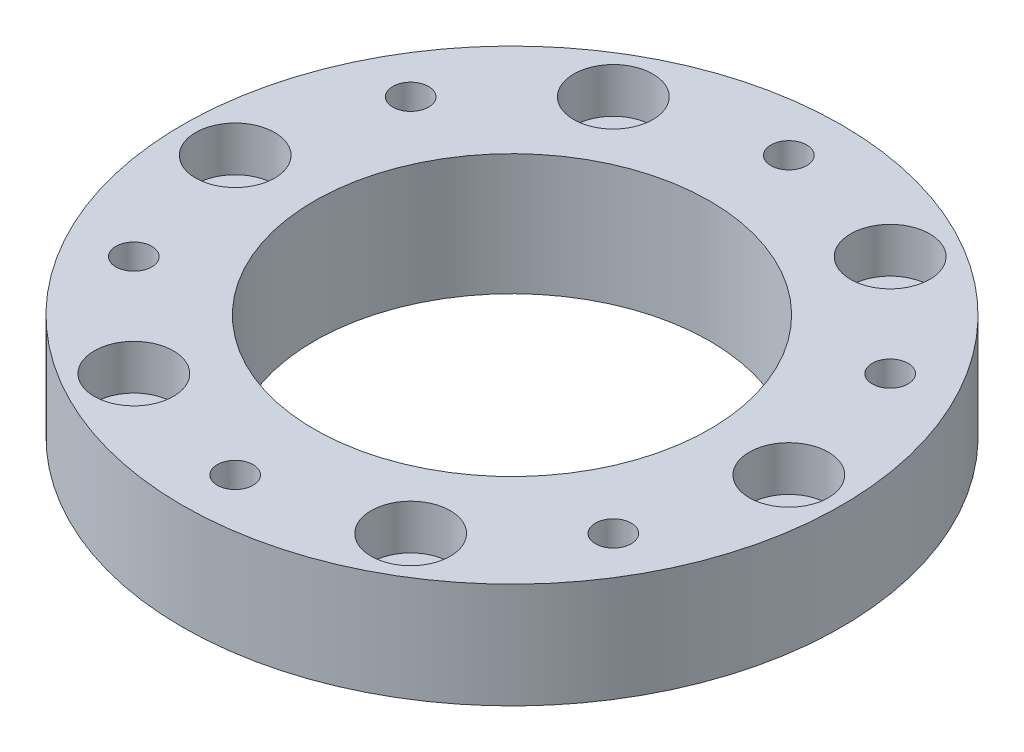
ISO-10303-21;
HEADER;
FILE_DESCRIPTION(('STEP AP214'),'2;1');
FILE_NAME('part.step','',(''),(''),'','','');
FILE_SCHEMA(('AUTOMOTIVE_DESIGN { 1 0 10303 214 1 1 1 1 }'));
ENDSEC;
DATA;
#1=APPLICATION_CONTEXT('core data for automotive mechanical design processes');
#2=APPLICATION_PROTOCOL_DEFINITION('international standard','automotive_design',2000,#1);
#3=PRODUCT_CONTEXT('',#1,'mechanical');
#4=PRODUCT('Part','Part','',(#3));
#5=PRODUCT_RELATED_PRODUCT_CATEGORY('part','',(#4));
#6=PRODUCT_DEFINITION_FORMATION('','',#4);
#7=PRODUCT_DEFINITION_CONTEXT('part definition',#1,'design');
#8=PRODUCT_DEFINITION('design','',#6,#7);
#9=PRODUCT_DEFINITION_SHAPE('','',#8);
#10=(LENGTH_UNIT() NAMED_UNIT(*) SI_UNIT(.MILLI.,.METRE.));
#11=(NAMED_UNIT(*) PLANE_ANGLE_UNIT() SI_UNIT($,.RADIAN.));
#12=(NAMED_UNIT(*) SI_UNIT($,.STERADIAN.) SOLID_ANGLE_UNIT());
#13=UNCERTAINTY_MEASURE_WITH_UNIT(LENGTH_MEASURE(1.E-05),#10,'distance_accuracy_value','');
#14=(GEOMETRIC_REPRESENTATION_CONTEXT(3) GLOBAL_UNCERTAINTY_ASSIGNED_CONTEXT((#13)) GLOBAL_UNIT_ASSIGNED_CONTEXT((#10,
#11,#12)) REPRESENTATION_CONTEXT('',''));
#15=CARTESIAN_POINT('',(0.,0.,0.));
#16=DIRECTION('',(0.,0.,1.));
#17=DIRECTION('',(1.,0.,0.));
#18=AXIS2_PLACEMENT_3D('',#15,#16,#17);
#19=CARTESIAN_POINT('',(26.2500000000006,23.,-45.4663336986827));
#20=DIRECTION('',(0.,1.,0.));
#21=DIRECTION('',(0.,0.,1.));
#22=AXIS2_PLACEMENT_3D('',#19,#20,#21);
#23=CYLINDRICAL_SURFACE('',#22,4.5);
#24=CARTESIAN_POINT('',(26.2500000000006,3.,-45.4663336986827));
#25=DIRECTION('',(0.,1.,0.));
#26=DIRECTION('',(0.,0.,1.));
#27=AXIS2_PLACEMENT_3D('',#24,#25,#26);
#28=CIRCLE('',#27,4.5);
#29=CARTESIAN_POINT('',(26.2500000000006,3.,-40.9663336986827));
#30=VERTEX_POINT('',#29);
#31=EDGE_CURVE('E146',#30,#30,#28,.F.);
#32=ORIENTED_EDGE('',*,*,#31,.T.);
#33=EDGE_LOOP('',(#32));
#34=FACE_BOUND('',#33,.T.);
#35=CARTESIAN_POINT('',(26.2500000000006,14.5,-45.4663336986827));
#36=DIRECTION('',(0.,1.,0.));
#37=DIRECTION('',(0.,0.,1.));
#38=AXIS2_PLACEMENT_3D('',#35,#36,#37);
#39=CIRCLE('',#38,4.5);
#40=CARTESIAN_POINT('',(26.2500000000006,14.5,-40.9663336986827));
#41=VERTEX_POINT('',#40);
#42=EDGE_CURVE('E20',#41,#41,#39,.T.);
#43=ORIENTED_EDGE('',*,*,#42,.T.);
#44=EDGE_LOOP('',(#43));
#45=FACE_BOUND('',#44,.T.);
#46=ADVANCED_FACE('F17',(#34,#45),#23,.F.);
#47=CARTESIAN_POINT('',(-26.2499999999996,23.,-45.4663336986833));
#48=DIRECTION('',(0.,1.,0.));
#49=DIRECTION('',(0.,0.,1.));
#50=AXIS2_PLACEMENT_3D('',#47,#48,#49);
#51=CYLINDRICAL_SURFACE('',#50,4.5);
#52=CARTESIAN_POINT('',(-26.2499999999996,3.,-45.4663336986833));
#53=DIRECTION('',(0.,1.,0.));
#54=DIRECTION('',(0.,0.,1.));
#55=AXIS2_PLACEMENT_3D('',#52,#53,#54);
#56=CIRCLE('',#55,4.5);
#57=CARTESIAN_POINT('',(-26.2499999999996,3.,-40.9663336986833));
#58=VERTEX_POINT('',#57);
#59=EDGE_CURVE('E143',#58,#58,#56,.F.);
#60=ORIENTED_EDGE('',*,*,#59,.T.);
#61=EDGE_LOOP('',(#60));
#62=FACE_BOUND('',#61,.T.);
#63=CARTESIAN_POINT('',(-26.2499999999996,14.5,-45.4663336986833));
#64=DIRECTION('',(0.,1.,0.));
#65=DIRECTION('',(0.,0.,1.));
#66=AXIS2_PLACEMENT_3D('',#63,#64,#65);
#67=CIRCLE('',#66,4.5);
#68=CARTESIAN_POINT('',(-26.2499999999996,14.5,-40.9663336986833));
#69=VERTEX_POINT('',#68);
#70=EDGE_CURVE('E160',#69,#69,#67,.T.);
#71=ORIENTED_EDGE('',*,*,#70,.T.);
#72=EDGE_LOOP('',(#71));
#73=FACE_BOUND('',#72,.T.);
#74=ADVANCED_FACE('F282',(#62,#73),#51,.F.);
#75=CARTESIAN_POINT('',(-52.5,23.,0.));
#76=DIRECTION('',(0.,1.,0.));
#77=DIRECTION('',(0.,0.,1.));
#78=AXIS2_PLACEMENT_3D('',#75,#76,#77);
#79=CYLINDRICAL_SURFACE('',#78,4.5);
#80=CARTESIAN_POINT('',(-52.5,3.,0.));
#81=DIRECTION('',(0.,1.,0.));
#82=DIRECTION('',(0.,0.,1.));
#83=AXIS2_PLACEMENT_3D('',#80,#81,#82);
#84=CIRCLE('',#83,4.5);
#85=CARTESIAN_POINT('',(-52.5,3.,4.5));
#86=VERTEX_POINT('',#85);
#87=EDGE_CURVE('E140',#86,#86,#84,.F.);
#88=ORIENTED_EDGE('',*,*,#87,.T.);
#89=EDGE_LOOP('',(#88));
#90=FACE_BOUND('',#89,.T.);
#91=CARTESIAN_POINT('',(-52.5,14.5,0.));
#92=DIRECTION('',(0.,1.,0.));
#93=DIRECTION('',(0.,0.,1.));
#94=AXIS2_PLACEMENT_3D('',#91,#92,#93);
#95=CIRCLE('',#94,4.5);
#96=CARTESIAN_POINT('',(-52.5,14.5,4.5));
#97=VERTEX_POINT('',#96);
#98=EDGE_CURVE('E158',#97,#97,#95,.T.);
#99=ORIENTED_EDGE('',*,*,#98,.T.);
#100=EDGE_LOOP('',(#99));
#101=FACE_BOUND('',#100,.T.);
#102=ADVANCED_FACE('F279',(#90,#101),#79,.F.);
#103=CARTESIAN_POINT('',(-26.25,23.,45.4663336986829));
#104=DIRECTION('',(0.,1.,0.));
#105=DIRECTION('',(0.,0.,1.));
#106=AXIS2_PLACEMENT_3D('',#103,#104,#105);
#107=CYLINDRICAL_SURFACE('',#106,4.5);
#108=CARTESIAN_POINT('',(-26.25,3.,45.4663336986829));
#109=DIRECTION('',(0.,1.,0.));
#110=DIRECTION('',(0.,0.,1.));
#111=AXIS2_PLACEMENT_3D('',#108,#109,#110);
#112=CIRCLE('',#111,4.5);
#113=CARTESIAN_POINT('',(-26.25,3.,49.9663336986829));
#114=VERTEX_POINT('',#113);
#115=EDGE_CURVE('E137',#114,#114,#112,.F.);
#116=ORIENTED_EDGE('',*,*,#115,.T.);
#117=EDGE_LOOP('',(#116));
#118=FACE_BOUND('',#117,.T.);
#119=CARTESIAN_POINT('',(-26.25,14.5,45.4663336986829));
#120=DIRECTION('',(0.,1.,0.));
#121=DIRECTION('',(0.,0.,1.));
#122=AXIS2_PLACEMENT_3D('',#119,#120,#121);
#123=CIRCLE('',#122,4.5);
#124=CARTESIAN_POINT('',(-26.25,14.5,49.9663336986829));
#125=VERTEX_POINT('',#124);
#126=EDGE_CURVE('E155',#125,#125,#123,.T.);
#127=ORIENTED_EDGE('',*,*,#126,.T.);
#128=EDGE_LOOP('',(#127));
#129=FACE_BOUND('',#128,.T.);
#130=ADVANCED_FACE('F281',(#118,#129),#107,.F.);
#131=CARTESIAN_POINT('',(26.25,23.,45.4663336986831));
#132=DIRECTION('',(0.,1.,0.));
#133=DIRECTION('',(0.,0.,1.));
#134=AXIS2_PLACEMENT_3D('',#131,#132,#133);
#135=CYLINDRICAL_SURFACE('',#134,4.5);
#136=CARTESIAN_POINT('',(26.25,3.,45.4663336986831));
#137=DIRECTION('',(0.,1.,0.));
#138=DIRECTION('',(0.,0.,1.));
#139=AXIS2_PLACEMENT_3D('',#136,#137,#138);
#140=CIRCLE('',#139,4.5);
#141=CARTESIAN_POINT('',(26.25,3.,49.9663336986831));
#142=VERTEX_POINT('',#141);
#143=EDGE_CURVE('E134',#142,#142,#140,.F.);
#144=ORIENTED_EDGE('',*,*,#143,.T.);
#145=EDGE_LOOP('',(#144));
#146=FACE_BOUND('',#145,.T.);
#147=CARTESIAN_POINT('',(26.25,14.5,45.4663336986831));
#148=DIRECTION('',(0.,1.,0.));
#149=DIRECTION('',(0.,0.,1.));
#150=AXIS2_PLACEMENT_3D('',#147,#148,#149);
#151=CIRCLE('',#150,4.5);
#152=CARTESIAN_POINT('',(26.25,14.5,49.9663336986831));
#153=VERTEX_POINT('',#152);
#154=EDGE_CURVE('E152',#153,#153,#151,.T.);
#155=ORIENTED_EDGE('',*,*,#154,.T.);
#156=EDGE_LOOP('',(#155));
#157=FACE_BOUND('',#156,.T.);
#158=ADVANCED_FACE('F290',(#146,#157),#135,.F.);
#159=CARTESIAN_POINT('',(52.5,23.,0.));
#160=DIRECTION('',(0.,1.,0.));
#161=DIRECTION('',(0.,0.,1.));
#162=AXIS2_PLACEMENT_3D('',#159,#160,#161);
#163=CYLINDRICAL_SURFACE('',#162,4.5);
#164=CARTESIAN_POINT('',(52.5,3.,0.));
#165=DIRECTION('',(0.,1.,0.));
#166=DIRECTION('',(0.,0.,1.));
#167=AXIS2_PLACEMENT_3D('',#164,#165,#166);
#168=CIRCLE('',#167,4.5);
#169=CARTESIAN_POINT('',(52.5,3.,4.5));
#170=VERTEX_POINT('',#169);
#171=EDGE_CURVE('E131',#170,#170,#168,.F.);
#172=ORIENTED_EDGE('',*,*,#171,.T.);
#173=EDGE_LOOP('',(#172));
#174=FACE_BOUND('',#173,.T.);
#175=CARTESIAN_POINT('',(52.5,14.5,0.));
#176=DIRECTION('',(0.,1.,0.));
#177=DIRECTION('',(0.,0.,1.));
#178=AXIS2_PLACEMENT_3D('',#175,#176,#177);
#179=CIRCLE('',#178,4.5);
#180=CARTESIAN_POINT('',(52.5,14.5,4.5));
#181=VERTEX_POINT('',#180);
#182=EDGE_CURVE('E149',#181,#181,#179,.T.);
#183=ORIENTED_EDGE('',*,*,#182,.T.);
#184=EDGE_LOOP('',(#183));
#185=FACE_BOUND('',#184,.T.);
#186=ADVANCED_FACE('F297',(#174,#185),#163,.F.);
#187=CARTESIAN_POINT('',(0.,3.,0.));
#188=DIRECTION('',(0.,-1.,0.));
#189=DIRECTION('',(0.,0.,-1.));
#190=AXIS2_PLACEMENT_3D('',#187,#188,#189);
#191=CYLINDRICAL_SURFACE('',#190,45.);
#192=CARTESIAN_POINT('',(0.,3.,0.));
#193=DIRECTION('',(0.,-1.,0.));
#194=DIRECTION('',(0.,0.,-1.));
#195=AXIS2_PLACEMENT_3D('',#192,#193,#194);
#196=CIRCLE('',#195,45.);
#197=CARTESIAN_POINT('',(0.,3.,-45.));
#198=VERTEX_POINT('',#197);
#199=EDGE_CURVE('E62',#198,#198,#196,.T.);
#200=ORIENTED_EDGE('',*,*,#199,.T.);
#201=EDGE_LOOP('',(#200));
#202=FACE_BOUND('',#201,.T.);
#203=CARTESIAN_POINT('',(0.,0.,0.));
#204=DIRECTION('',(0.,-1.,0.));
#205=DIRECTION('',(0.,0.,-1.));
#206=AXIS2_PLACEMENT_3D('',#203,#204,#205);
#207=CIRCLE('',#206,45.);
#208=CARTESIAN_POINT('',(0.,0.,-45.));
#209=VERTEX_POINT('',#208);
#210=EDGE_CURVE('E56',#209,#209,#207,.F.);
#211=ORIENTED_EDGE('',*,*,#210,.T.);
#212=EDGE_LOOP('',(#211));
#213=FACE_BOUND('',#212,.T.);
#214=ADVANCED_FACE('F49',(#202,#213),#191,.T.);
#215=CARTESIAN_POINT('',(-45.4663336986827,8.00000000009504,-26.2500000000006));
#216=DIRECTION('',(0.,1.,0.));
#217=DIRECTION('',(0.,0.,1.));
#218=AXIS2_PLACEMENT_3D('',#215,#216,#217);
#219=CONICAL_SURFACE('',#218,3.40000000016569,1.02974425867367);
#220=CARTESIAN_POINT('',(-45.4663336986827,5.95707389533118,-26.2500000000006));
#221=VERTEX_POINT('',#220);
#222=VERTEX_LOOP('',#221);
#223=FACE_BOUND('',#222,.T.);
#224=CARTESIAN_POINT('',(-45.4663336986827,8.,-26.2500000000006));
#225=DIRECTION('',(0.,1.,0.));
#226=DIRECTION('',(0.,0.,1.));
#227=AXIS2_PLACEMENT_3D('',#224,#225,#226);
#228=CIRCLE('',#227,3.4);
#229=CARTESIAN_POINT('',(-45.4663336986827,8.,-22.8500000000006));
#230=VERTEX_POINT('',#229);
#231=EDGE_CURVE('E53',#230,#230,#228,.T.);
#232=ORIENTED_EDGE('',*,*,#231,.T.);
#233=EDGE_LOOP('',(#232));
#234=FACE_BOUND('',#233,.T.);
#235=ADVANCED_FACE('F45',(#223,#234),#219,.F.);
#236=CARTESIAN_POINT('',(-45.4663336986833,8.00000000015189,26.2499999999996));
#237=DIRECTION('',(0.,1.,0.));
#238=DIRECTION('',(0.,0.,1.));
#239=AXIS2_PLACEMENT_3D('',#236,#237,#238);
#240=CONICAL_SURFACE('',#239,3.40000000023152,1.02974425867615);
#241=CARTESIAN_POINT('',(-45.4663336986833,5.95707389533118,26.2499999999996));
#242=VERTEX_POINT('',#241);
#243=VERTEX_LOOP('',#242);
#244=FACE_BOUND('',#243,.T.);
#245=CARTESIAN_POINT('',(-45.4663336986833,8.,26.2499999999996));
#246=DIRECTION('',(0.,1.,0.));
#247=DIRECTION('',(0.,0.,1.));
#248=AXIS2_PLACEMENT_3D('',#245,#246,#247);
#249=CIRCLE('',#248,3.4);
#250=CARTESIAN_POINT('',(-45.4663336986833,8.,29.6499999999996));
#251=VERTEX_POINT('',#250);
#252=EDGE_CURVE('E55',#251,#251,#249,.T.);
#253=ORIENTED_EDGE('',*,*,#252,.T.);
#254=EDGE_LOOP('',(#253));
#255=FACE_BOUND('',#254,.T.);
#256=ADVANCED_FACE('F48',(#244,#255),#240,.F.);
#257=CARTESIAN_POINT('',(0.,7.99999999986767,52.5));
#258=DIRECTION('',(0.,1.,0.));
#259=DIRECTION('',(0.,0.,1.));
#260=AXIS2_PLACEMENT_3D('',#257,#258,#259);
#261=CONICAL_SURFACE('',#260,3.3999999997809,1.02974425861699);
#262=CARTESIAN_POINT('',(0.,5.95707389527433,52.5));
#263=VERTEX_POINT('',#262);
#264=VERTEX_LOOP('',#263);
#265=FACE_BOUND('',#264,.T.);
#266=CARTESIAN_POINT('',(0.,8.,52.5));
#267=DIRECTION('',(0.,1.,0.));
#268=DIRECTION('',(0.,0.,1.));
#269=AXIS2_PLACEMENT_3D('',#266,#267,#268);
#270=CIRCLE('',#269,3.4);
#271=CARTESIAN_POINT('',(0.,8.,55.9));
#272=VERTEX_POINT('',#271);
#273=EDGE_CURVE('E59',#272,#272,#270,.T.);
#274=ORIENTED_EDGE('',*,*,#273,.T.);
#275=EDGE_LOOP('',(#274));
#276=FACE_BOUND('',#275,.T.);
#277=ADVANCED_FACE('F307',(#265,#276),#261,.F.);
#278=CARTESIAN_POINT('',(45.4663336986829,8.00000000015189,26.25));
#279=DIRECTION('',(0.,1.,0.));
#280=DIRECTION('',(0.,0.,1.));
#281=AXIS2_PLACEMENT_3D('',#278,#279,#280);
#282=CONICAL_SURFACE('',#281,3.40000000023089,1.02974425867615);
#283=CARTESIAN_POINT('',(45.4663336986829,5.95707389533118,26.25));
#284=VERTEX_POINT('',#283);
#285=VERTEX_LOOP('',#284);
#286=FACE_BOUND('',#285,.T.);
#287=CARTESIAN_POINT('',(45.4663336986829,8.,26.25));
#288=DIRECTION('',(0.,1.,0.));
#289=DIRECTION('',(0.,0.,1.));
#290=AXIS2_PLACEMENT_3D('',#287,#288,#289);
#291=CIRCLE('',#290,3.4);
#292=CARTESIAN_POINT('',(45.4663336986829,8.,29.65));
#293=VERTEX_POINT('',#292);
#294=EDGE_CURVE('E325',#293,#293,#291,.T.);
#295=ORIENTED_EDGE('',*,*,#294,.T.);
#296=EDGE_LOOP('',(#295));
#297=FACE_BOUND('',#296,.T.);
#298=ADVANCED_FACE('F310',(#286,#297),#282,.F.);
#299=CARTESIAN_POINT('',(45.4663336986831,8.00000000009504,-26.25));
#300=DIRECTION('',(0.,1.,0.));
#301=DIRECTION('',(0.,0.,1.));
#302=AXIS2_PLACEMENT_3D('',#299,#300,#301);
#303=CONICAL_SURFACE('',#302,3.40000000016506,1.02974425867367);
#304=CARTESIAN_POINT('',(45.4663336986831,5.95707389533118,-26.25));
#305=VERTEX_POINT('',#304);
#306=VERTEX_LOOP('',#305);
#307=FACE_BOUND('',#306,.T.);
#308=CARTESIAN_POINT('',(45.4663336986831,8.,-26.25));
#309=DIRECTION('',(0.,1.,0.));
#310=DIRECTION('',(0.,0.,1.));
#311=AXIS2_PLACEMENT_3D('',#308,#309,#310);
#312=CIRCLE('',#311,3.4);
#313=CARTESIAN_POINT('',(45.4663336986831,8.,-22.85));
#314=VERTEX_POINT('',#313);
#315=EDGE_CURVE('E323',#314,#314,#312,.T.);
#316=ORIENTED_EDGE('',*,*,#315,.T.);
#317=EDGE_LOOP('',(#316));
#318=FACE_BOUND('',#317,.T.);
#319=ADVANCED_FACE('F183',(#307,#318),#303,.F.);
#320=CARTESIAN_POINT('',(0.,7.99999999986767,-52.5));
#321=DIRECTION('',(0.,1.,0.));
#322=DIRECTION('',(0.,0.,1.));
#323=AXIS2_PLACEMENT_3D('',#320,#321,#322);
#324=CONICAL_SURFACE('',#323,3.39999999976271,1.02974425856555);
#325=CARTESIAN_POINT('',(0.,5.95707389518907,-52.4999999999432));
#326=VERTEX_POINT('',#325);
#327=VERTEX_LOOP('',#326);
#328=FACE_BOUND('',#327,.T.);
#329=CARTESIAN_POINT('',(0.,8.,-52.5));
#330=DIRECTION('',(0.,1.,0.));
#331=DIRECTION('',(0.,0.,1.));
#332=AXIS2_PLACEMENT_3D('',#329,#330,#331);
#333=CIRCLE('',#332,3.4);
#334=CARTESIAN_POINT('',(0.,8.,-49.1));
#335=VERTEX_POINT('',#334);
#336=EDGE_CURVE('E127',#335,#335,#333,.T.);
#337=ORIENTED_EDGE('',*,*,#336,.T.);
#338=EDGE_LOOP('',(#337));
#339=FACE_BOUND('',#338,.T.);
#340=ADVANCED_FACE('F171',(#328,#339),#324,.F.);
#341=CARTESIAN_POINT('',(30.7500000000006,14.5,-45.4663336986827));
#342=DIRECTION('',(0.,-1.,0.));
#343=DIRECTION('',(0.,0.,-1.));
#344=AXIS2_PLACEMENT_3D('',#341,#342,#343);
#345=PLANE('',#344);
#346=CARTESIAN_POINT('',(26.2500000000006,14.5,-45.4663336986827));
#347=DIRECTION('',(0.,1.,0.));
#348=DIRECTION('',(0.,0.,1.));
#349=AXIS2_PLACEMENT_3D('',#346,#347,#348);
#350=CIRCLE('',#349,7.5);
#351=CARTESIAN_POINT('',(26.2500000000006,14.5,-37.9663336986827));
#352=VERTEX_POINT('',#351);
#353=EDGE_CURVE('E125',#352,#352,#350,.T.);
#354=ORIENTED_EDGE('',*,*,#353,.T.);
#355=EDGE_LOOP('',(#354));
#356=FACE_BOUND('',#355,.T.);
#357=ORIENTED_EDGE('',*,*,#42,.F.);
#358=EDGE_LOOP('',(#357));
#359=FACE_BOUND('',#358,.T.);
#360=ADVANCED_FACE('F168',(#356,#359),#345,.F.);
#361=CARTESIAN_POINT('',(-21.7499999999996,14.5,-45.4663336986833));
#362=DIRECTION('',(0.,-1.,0.));
#363=DIRECTION('',(0.,0.,-1.));
#364=AXIS2_PLACEMENT_3D('',#361,#362,#363);
#365=PLANE('',#364);
#366=CARTESIAN_POINT('',(-26.2499999999996,14.5,-45.4663336986833));
#367=DIRECTION('',(0.,1.,0.));
#368=DIRECTION('',(0.,0.,1.));
#369=AXIS2_PLACEMENT_3D('',#366,#367,#368);
#370=CIRCLE('',#369,7.5);
#371=CARTESIAN_POINT('',(-26.2499999999996,14.5,-37.9663336986833));
#372=VERTEX_POINT('',#371);
#373=EDGE_CURVE('E122',#372,#372,#370,.T.);
#374=ORIENTED_EDGE('',*,*,#373,.T.);
#375=EDGE_LOOP('',(#374));
#376=FACE_BOUND('',#375,.T.);
#377=ORIENTED_EDGE('',*,*,#70,.F.);
#378=EDGE_LOOP('',(#377));
#379=FACE_BOUND('',#378,.T.);
#380=ADVANCED_FACE('F170',(#376,#379),#365,.F.);
#381=CARTESIAN_POINT('',(-48.,14.5,0.));
#382=DIRECTION('',(0.,-1.,0.));
#383=DIRECTION('',(0.,0.,-1.));
#384=AXIS2_PLACEMENT_3D('',#381,#382,#383);
#385=PLANE('',#384);
#386=CARTESIAN_POINT('',(-52.5,14.5,0.));
#387=DIRECTION('',(0.,1.,0.));
#388=DIRECTION('',(0.,0.,1.));
#389=AXIS2_PLACEMENT_3D('',#386,#387,#388);
#390=CIRCLE('',#389,7.5);
#391=CARTESIAN_POINT('',(-52.5,14.5,7.5));
#392=VERTEX_POINT('',#391);
#393=EDGE_CURVE('E119',#392,#392,#390,.T.);
#394=ORIENTED_EDGE('',*,*,#393,.T.);
#395=EDGE_LOOP('',(#394));
#396=FACE_BOUND('',#395,.T.);
#397=ORIENTED_EDGE('',*,*,#98,.F.);
#398=EDGE_LOOP('',(#397));
#399=FACE_BOUND('',#398,.T.);
#400=ADVANCED_FACE('F180',(#396,#399),#385,.F.);
#401=CARTESIAN_POINT('',(-21.75,14.5,45.4663336986829));
#402=DIRECTION('',(0.,-1.,0.));
#403=DIRECTION('',(0.,0.,-1.));
#404=AXIS2_PLACEMENT_3D('',#401,#402,#403);
#405=PLANE('',#404);
#406=CARTESIAN_POINT('',(-26.25,14.5,45.4663336986829));
#407=DIRECTION('',(0.,1.,0.));
#408=DIRECTION('',(0.,0.,1.));
#409=AXIS2_PLACEMENT_3D('',#406,#407,#408);
#410=CIRCLE('',#409,7.5);
#411=CARTESIAN_POINT('',(-26.25,14.5,52.9663336986829));
#412=VERTEX_POINT('',#411);
#413=EDGE_CURVE('E116',#412,#412,#410,.T.);
#414=ORIENTED_EDGE('',*,*,#413,.T.);
#415=EDGE_LOOP('',(#414));
#416=FACE_BOUND('',#415,.T.);
#417=ORIENTED_EDGE('',*,*,#126,.F.);
#418=EDGE_LOOP('',(#417));
#419=FACE_BOUND('',#418,.T.);
#420=ADVANCED_FACE('F265',(#416,#419),#405,.F.);
#421=CARTESIAN_POINT('',(30.75,14.5,45.4663336986831));
#422=DIRECTION('',(0.,-1.,0.));
#423=DIRECTION('',(0.,0.,-1.));
#424=AXIS2_PLACEMENT_3D('',#421,#422,#423);
#425=PLANE('',#424);
#426=CARTESIAN_POINT('',(26.25,14.5,45.4663336986831));
#427=DIRECTION('',(0.,1.,0.));
#428=DIRECTION('',(0.,0.,1.));
#429=AXIS2_PLACEMENT_3D('',#426,#427,#428);
#430=CIRCLE('',#429,7.5);
#431=CARTESIAN_POINT('',(26.25,14.5,52.9663336986831));
#432=VERTEX_POINT('',#431);
#433=EDGE_CURVE('E113',#432,#432,#430,.T.);
#434=ORIENTED_EDGE('',*,*,#433,.T.);
#435=EDGE_LOOP('',(#434));
#436=FACE_BOUND('',#435,.T.);
#437=ORIENTED_EDGE('',*,*,#154,.F.);
#438=EDGE_LOOP('',(#437));
#439=FACE_BOUND('',#438,.T.);
#440=ADVANCED_FACE('F261',(#436,#439),#425,.F.);
#441=CARTESIAN_POINT('',(57.,14.5,0.));
#442=DIRECTION('',(0.,-1.,0.));
#443=DIRECTION('',(0.,0.,-1.));
#444=AXIS2_PLACEMENT_3D('',#441,#442,#443);
#445=PLANE('',#444);
#446=CARTESIAN_POINT('',(52.5,14.5,0.));
#447=DIRECTION('',(0.,1.,0.));
#448=DIRECTION('',(0.,0.,1.));
#449=AXIS2_PLACEMENT_3D('',#446,#447,#448);
#450=CIRCLE('',#449,7.5);
#451=CARTESIAN_POINT('',(52.5,14.5,7.5));
#452=VERTEX_POINT('',#451);
#453=EDGE_CURVE('E110',#452,#452,#450,.T.);
#454=ORIENTED_EDGE('',*,*,#453,.T.);
#455=EDGE_LOOP('',(#454));
#456=FACE_BOUND('',#455,.T.);
#457=ORIENTED_EDGE('',*,*,#182,.F.);
#458=EDGE_LOOP('',(#457));
#459=FACE_BOUND('',#458,.T.);
#460=ADVANCED_FACE('F257',(#456,#459),#445,.F.);
#461=CARTESIAN_POINT('',(0.,3.,0.));
#462=DIRECTION('',(0.,1.,0.));
#463=DIRECTION('',(0.,0.,1.));
#464=AXIS2_PLACEMENT_3D('',#461,#462,#463);
#465=PLANE('',#464);
#466=ORIENTED_EDGE('',*,*,#199,.F.);
#467=EDGE_LOOP('',(#466));
#468=FACE_BOUND('',#467,.T.);
#469=CARTESIAN_POINT('',(0.,3.,0.));
#470=DIRECTION('',(0.,-1.,0.));
#471=DIRECTION('',(0.,0.,-1.));
#472=AXIS2_PLACEMENT_3D('',#469,#470,#471);
#473=CIRCLE('',#472,62.5);
#474=CARTESIAN_POINT('',(0.,3.,-62.5));
#475=VERTEX_POINT('',#474);
#476=EDGE_CURVE('E107',#475,#475,#473,.F.);
#477=ORIENTED_EDGE('',*,*,#476,.F.);
#478=EDGE_LOOP('',(#477));
#479=FACE_BOUND('',#478,.T.);
#480=ORIENTED_EDGE('',*,*,#171,.F.);
#481=EDGE_LOOP('',(#480));
#482=FACE_BOUND('',#481,.T.);
#483=ORIENTED_EDGE('',*,*,#143,.F.);
#484=EDGE_LOOP('',(#483));
#485=FACE_BOUND('',#484,.T.);
#486=ORIENTED_EDGE('',*,*,#115,.F.);
#487=EDGE_LOOP('',(#486));
#488=FACE_BOUND('',#487,.T.);
#489=ORIENTED_EDGE('',*,*,#87,.F.);
#490=EDGE_LOOP('',(#489));
#491=FACE_BOUND('',#490,.T.);
#492=ORIENTED_EDGE('',*,*,#59,.F.);
#493=EDGE_LOOP('',(#492));
#494=FACE_BOUND('',#493,.T.);
#495=ORIENTED_EDGE('',*,*,#31,.F.);
#496=EDGE_LOOP('',(#495));
#497=FACE_BOUND('',#496,.T.);
#498=ADVANCED_FACE('F253',(#468,#479,#482,#485,#488,#491,#494,#497),#465,.F.);
#499=CARTESIAN_POINT('',(0.,0.,0.));
#500=DIRECTION('',(0.,1.,0.));
#501=DIRECTION('',(0.,0.,1.));
#502=AXIS2_PLACEMENT_3D('',#499,#500,#501);
#503=PLANE('',#502);
#504=CARTESIAN_POINT('',(0.,0.,0.));
#505=DIRECTION('',(0.,-1.,0.));
#506=DIRECTION('',(0.,0.,-1.));
#507=AXIS2_PLACEMENT_3D('',#504,#505,#506);
#508=CIRCLE('',#507,37.5);
#509=CARTESIAN_POINT('',(0.,0.,-37.5));
#510=VERTEX_POINT('',#509);
#511=EDGE_CURVE('E104',#510,#510,#508,.F.);
#512=ORIENTED_EDGE('',*,*,#511,.T.);
#513=EDGE_LOOP('',(#512));
#514=FACE_BOUND('',#513,.T.);
#515=ORIENTED_EDGE('',*,*,#210,.F.);
#516=EDGE_LOOP('',(#515));
#517=FACE_BOUND('',#516,.T.);
#518=ADVANCED_FACE('F249',(#514,#517),#503,.F.);
#519=CARTESIAN_POINT('',(-45.4663336986827,23.,-26.2500000000006));
#520=DIRECTION('',(0.,1.,0.));
#521=DIRECTION('',(0.,0.,1.));
#522=AXIS2_PLACEMENT_3D('',#519,#520,#521);
#523=CYLINDRICAL_SURFACE('',#522,3.4);
#524=CARTESIAN_POINT('',(-45.4663336986827,23.,-26.2500000000006));
#525=DIRECTION('',(0.,1.,0.));
#526=DIRECTION('',(0.,0.,1.));
#527=AXIS2_PLACEMENT_3D('',#524,#525,#526);
#528=CIRCLE('',#527,3.4);
#529=CARTESIAN_POINT('',(-45.4663336986827,23.,-22.8500000000006));
#530=VERTEX_POINT('',#529);
#531=EDGE_CURVE('E101',#530,#530,#528,.F.);
#532=ORIENTED_EDGE('',*,*,#531,.F.);
#533=EDGE_LOOP('',(#532));
#534=FACE_BOUND('',#533,.T.);
#535=ORIENTED_EDGE('',*,*,#231,.F.);
#536=EDGE_LOOP('',(#535));
#537=FACE_BOUND('',#536,.T.);
#538=ADVANCED_FACE('F245',(#534,#537),#523,.F.);
#539=CARTESIAN_POINT('',(-45.4663336986833,23.,26.2499999999996));
#540=DIRECTION('',(0.,1.,0.));
#541=DIRECTION('',(0.,0.,1.));
#542=AXIS2_PLACEMENT_3D('',#539,#540,#541);
#543=CYLINDRICAL_SURFACE('',#542,3.4);
#544=CARTESIAN_POINT('',(-45.4663336986833,23.,26.2499999999996));
#545=DIRECTION('',(0.,1.,0.));
#546=DIRECTION('',(0.,0.,1.));
#547=AXIS2_PLACEMENT_3D('',#544,#545,#546);
#548=CIRCLE('',#547,3.4);
#549=CARTESIAN_POINT('',(-45.4663336986833,23.,29.6499999999996));
#550=VERTEX_POINT('',#549);
#551=EDGE_CURVE('E98',#550,#550,#548,.F.);
#552=ORIENTED_EDGE('',*,*,#551,.F.);
#553=EDGE_LOOP('',(#552));
#554=FACE_BOUND('',#553,.T.);
#555=ORIENTED_EDGE('',*,*,#252,.F.);
#556=EDGE_LOOP('',(#555));
#557=FACE_BOUND('',#556,.T.);
#558=ADVANCED_FACE('F241',(#554,#557),#543,.F.);
#559=CARTESIAN_POINT('',(0.,23.,52.5));
#560=DIRECTION('',(0.,1.,0.));
#561=DIRECTION('',(0.,0.,1.));
#562=AXIS2_PLACEMENT_3D('',#559,#560,#561);
#563=CYLINDRICAL_SURFACE('',#562,3.4);
#564=CARTESIAN_POINT('',(0.,23.,52.5));
#565=DIRECTION('',(0.,1.,0.));
#566=DIRECTION('',(0.,0.,1.));
#567=AXIS2_PLACEMENT_3D('',#564,#565,#566);
#568=CIRCLE('',#567,3.4);
#569=CARTESIAN_POINT('',(0.,23.,55.9));
#570=VERTEX_POINT('',#569);
#571=EDGE_CURVE('E95',#570,#570,#568,.F.);
#572=ORIENTED_EDGE('',*,*,#571,.F.);
#573=EDGE_LOOP('',(#572));
#574=FACE_BOUND('',#573,.T.);
#575=ORIENTED_EDGE('',*,*,#273,.F.);
#576=EDGE_LOOP('',(#575));
#577=FACE_BOUND('',#576,.T.);
#578=ADVANCED_FACE('F237',(#574,#577),#563,.F.);
#579=CARTESIAN_POINT('',(45.4663336986829,23.,26.25));
#580=DIRECTION('',(0.,1.,0.));
#581=DIRECTION('',(0.,0.,1.));
#582=AXIS2_PLACEMENT_3D('',#579,#580,#581);
#583=CYLINDRICAL_SURFACE('',#582,3.4);
#584=CARTESIAN_POINT('',(45.4663336986829,23.,26.25));
#585=DIRECTION('',(0.,1.,0.));
#586=DIRECTION('',(0.,0.,1.));
#587=AXIS2_PLACEMENT_3D('',#584,#585,#586);
#588=CIRCLE('',#587,3.4);
#589=CARTESIAN_POINT('',(45.4663336986829,23.,29.65));
#590=VERTEX_POINT('',#589);
#591=EDGE_CURVE('E92',#590,#590,#588,.F.);
#592=ORIENTED_EDGE('',*,*,#591,.F.);
#593=EDGE_LOOP('',(#592));
#594=FACE_BOUND('',#593,.T.);
#595=ORIENTED_EDGE('',*,*,#294,.F.);
#596=EDGE_LOOP('',(#595));
#597=FACE_BOUND('',#596,.T.);
#598=ADVANCED_FACE('F233',(#594,#597),#583,.F.);
#599=CARTESIAN_POINT('',(45.4663336986831,23.,-26.25));
#600=DIRECTION('',(0.,1.,0.));
#601=DIRECTION('',(0.,0.,1.));
#602=AXIS2_PLACEMENT_3D('',#599,#600,#601);
#603=CYLINDRICAL_SURFACE('',#602,3.4);
#604=CARTESIAN_POINT('',(45.4663336986831,23.,-26.25));
#605=DIRECTION('',(0.,1.,0.));
#606=DIRECTION('',(0.,0.,1.));
#607=AXIS2_PLACEMENT_3D('',#604,#605,#606);
#608=CIRCLE('',#607,3.4);
#609=CARTESIAN_POINT('',(45.4663336986831,23.,-22.85));
#610=VERTEX_POINT('',#609);
#611=EDGE_CURVE('E89',#610,#610,#608,.F.);
#612=ORIENTED_EDGE('',*,*,#611,.F.);
#613=EDGE_LOOP('',(#612));
#614=FACE_BOUND('',#613,.T.);
#615=ORIENTED_EDGE('',*,*,#315,.F.);
#616=EDGE_LOOP('',(#615));
#617=FACE_BOUND('',#616,.T.);
#618=ADVANCED_FACE('F229',(#614,#617),#603,.F.);
#619=CARTESIAN_POINT('',(0.,23.,-52.5));
#620=DIRECTION('',(0.,1.,0.));
#621=DIRECTION('',(0.,0.,1.));
#622=AXIS2_PLACEMENT_3D('',#619,#620,#621);
#623=CYLINDRICAL_SURFACE('',#622,3.4);
#624=CARTESIAN_POINT('',(0.,23.,-52.5));
#625=DIRECTION('',(0.,1.,0.));
#626=DIRECTION('',(0.,0.,1.));
#627=AXIS2_PLACEMENT_3D('',#624,#625,#626);
#628=CIRCLE('',#627,3.4);
#629=CARTESIAN_POINT('',(0.,23.,-49.1));
#630=VERTEX_POINT('',#629);
#631=EDGE_CURVE('E86',#630,#630,#628,.F.);
#632=ORIENTED_EDGE('',*,*,#631,.F.);
#633=EDGE_LOOP('',(#632));
#634=FACE_BOUND('',#633,.T.);
#635=ORIENTED_EDGE('',*,*,#336,.F.);
#636=EDGE_LOOP('',(#635));
#637=FACE_BOUND('',#636,.T.);
#638=ADVANCED_FACE('F225',(#634,#637),#623,.F.);
#639=CARTESIAN_POINT('',(26.2500000000006,23.,-45.4663336986827));
#640=DIRECTION('',(0.,1.,0.));
#641=DIRECTION('',(0.,0.,1.));
#642=AXIS2_PLACEMENT_3D('',#639,#640,#641);
#643=CYLINDRICAL_SURFACE('',#642,7.5);
#644=CARTESIAN_POINT('',(26.2500000000006,23.,-45.4663336986827));
#645=DIRECTION('',(0.,1.,0.));
#646=DIRECTION('',(0.,0.,1.));
#647=AXIS2_PLACEMENT_3D('',#644,#645,#646);
#648=CIRCLE('',#647,7.5);
#649=CARTESIAN_POINT('',(26.2500000000006,23.,-37.9663336986827));
#650=VERTEX_POINT('',#649);
#651=EDGE_CURVE('E83',#650,#650,#648,.F.);
#652=ORIENTED_EDGE('',*,*,#651,.F.);
#653=EDGE_LOOP('',(#652));
#654=FACE_BOUND('',#653,.T.);
#655=ORIENTED_EDGE('',*,*,#353,.F.);
#656=EDGE_LOOP('',(#655));
#657=FACE_BOUND('',#656,.T.);
#658=ADVANCED_FACE('F221',(#654,#657),#643,.F.);
#659=CARTESIAN_POINT('',(-26.2499999999996,23.,-45.4663336986833));
#660=DIRECTION('',(0.,1.,0.));
#661=DIRECTION('',(0.,0.,1.));
#662=AXIS2_PLACEMENT_3D('',#659,#660,#661);
#663=CYLINDRICAL_SURFACE('',#662,7.5);
#664=CARTESIAN_POINT('',(-26.2499999999996,23.,-45.4663336986833));
#665=DIRECTION('',(0.,1.,0.));
#666=DIRECTION('',(0.,0.,1.));
#667=AXIS2_PLACEMENT_3D('',#664,#665,#666);
#668=CIRCLE('',#667,7.5);
#669=CARTESIAN_POINT('',(-26.2499999999996,23.,-37.9663336986833));
#670=VERTEX_POINT('',#669);
#671=EDGE_CURVE('E80',#670,#670,#668,.F.);
#672=ORIENTED_EDGE('',*,*,#671,.F.);
#673=EDGE_LOOP('',(#672));
#674=FACE_BOUND('',#673,.T.);
#675=ORIENTED_EDGE('',*,*,#373,.F.);
#676=EDGE_LOOP('',(#675));
#677=FACE_BOUND('',#676,.T.);
#678=ADVANCED_FACE('F217',(#674,#677),#663,.F.);
#679=CARTESIAN_POINT('',(-52.5,23.,0.));
#680=DIRECTION('',(0.,1.,0.));
#681=DIRECTION('',(0.,0.,1.));
#682=AXIS2_PLACEMENT_3D('',#679,#680,#681);
#683=CYLINDRICAL_SURFACE('',#682,7.5);
#684=CARTESIAN_POINT('',(-52.5,23.,0.));
#685=DIRECTION('',(0.,1.,0.));
#686=DIRECTION('',(0.,0.,1.));
#687=AXIS2_PLACEMENT_3D('',#684,#685,#686);
#688=CIRCLE('',#687,7.5);
#689=CARTESIAN_POINT('',(-52.5,23.,7.5));
#690=VERTEX_POINT('',#689);
#691=EDGE_CURVE('E77',#690,#690,#688,.F.);
#692=ORIENTED_EDGE('',*,*,#691,.F.);
#693=EDGE_LOOP('',(#692));
#694=FACE_BOUND('',#693,.T.);
#695=ORIENTED_EDGE('',*,*,#393,.F.);
#696=EDGE_LOOP('',(#695));
#697=FACE_BOUND('',#696,.T.);
#698=ADVANCED_FACE('F213',(#694,#697),#683,.F.);
#699=CARTESIAN_POINT('',(-26.25,23.,45.4663336986829));
#700=DIRECTION('',(0.,1.,0.));
#701=DIRECTION('',(0.,0.,1.));
#702=AXIS2_PLACEMENT_3D('',#699,#700,#701);
#703=CYLINDRICAL_SURFACE('',#702,7.5);
#704=CARTESIAN_POINT('',(-26.25,23.,45.4663336986829));
#705=DIRECTION('',(0.,1.,0.));
#706=DIRECTION('',(0.,0.,1.));
#707=AXIS2_PLACEMENT_3D('',#704,#705,#706);
#708=CIRCLE('',#707,7.5);
#709=CARTESIAN_POINT('',(-26.25,23.,52.9663336986829));
#710=VERTEX_POINT('',#709);
#711=EDGE_CURVE('E74',#710,#710,#708,.F.);
#712=ORIENTED_EDGE('',*,*,#711,.F.);
#713=EDGE_LOOP('',(#712));
#714=FACE_BOUND('',#713,.T.);
#715=ORIENTED_EDGE('',*,*,#413,.F.);
#716=EDGE_LOOP('',(#715));
#717=FACE_BOUND('',#716,.T.);
#718=ADVANCED_FACE('F209',(#714,#717),#703,.F.);
#719=CARTESIAN_POINT('',(26.25,23.,45.4663336986831));
#720=DIRECTION('',(0.,1.,0.));
#721=DIRECTION('',(0.,0.,1.));
#722=AXIS2_PLACEMENT_3D('',#719,#720,#721);
#723=CYLINDRICAL_SURFACE('',#722,7.5);
#724=CARTESIAN_POINT('',(26.25,23.,45.4663336986831));
#725=DIRECTION('',(0.,1.,0.));
#726=DIRECTION('',(0.,0.,1.));
#727=AXIS2_PLACEMENT_3D('',#724,#725,#726);
#728=CIRCLE('',#727,7.5);
#729=CARTESIAN_POINT('',(26.25,23.,52.9663336986831));
#730=VERTEX_POINT('',#729);
#731=EDGE_CURVE('E71',#730,#730,#728,.F.);
#732=ORIENTED_EDGE('',*,*,#731,.F.);
#733=EDGE_LOOP('',(#732));
#734=FACE_BOUND('',#733,.T.);
#735=ORIENTED_EDGE('',*,*,#433,.F.);
#736=EDGE_LOOP('',(#735));
#737=FACE_BOUND('',#736,.T.);
#738=ADVANCED_FACE('F205',(#734,#737),#723,.F.);
#739=CARTESIAN_POINT('',(52.5,23.,0.));
#740=DIRECTION('',(0.,1.,0.));
#741=DIRECTION('',(0.,0.,1.));
#742=AXIS2_PLACEMENT_3D('',#739,#740,#741);
#743=CYLINDRICAL_SURFACE('',#742,7.5);
#744=CARTESIAN_POINT('',(52.5,23.,0.));
#745=DIRECTION('',(0.,1.,0.));
#746=DIRECTION('',(0.,0.,1.));
#747=AXIS2_PLACEMENT_3D('',#744,#745,#746);
#748=CIRCLE('',#747,7.5);
#749=CARTESIAN_POINT('',(52.5,23.,7.5));
#750=VERTEX_POINT('',#749);
#751=EDGE_CURVE('E68',#750,#750,#748,.F.);
#752=ORIENTED_EDGE('',*,*,#751,.F.);
#753=EDGE_LOOP('',(#752));
#754=FACE_BOUND('',#753,.T.);
#755=ORIENTED_EDGE('',*,*,#453,.F.);
#756=EDGE_LOOP('',(#755));
#757=FACE_BOUND('',#756,.T.);
#758=ADVANCED_FACE('F201',(#754,#757),#743,.F.);
#759=CARTESIAN_POINT('',(0.,23.,0.));
#760=DIRECTION('',(0.,-1.,0.));
#761=DIRECTION('',(0.,0.,-1.));
#762=AXIS2_PLACEMENT_3D('',#759,#760,#761);
#763=CYLINDRICAL_SURFACE('',#762,62.5);
#764=ORIENTED_EDGE('',*,*,#476,.T.);
#765=EDGE_LOOP('',(#764));
#766=FACE_BOUND('',#765,.T.);
#767=CARTESIAN_POINT('',(0.,23.,0.));
#768=DIRECTION('',(0.,-1.,0.));
#769=DIRECTION('',(0.,0.,-1.));
#770=AXIS2_PLACEMENT_3D('',#767,#768,#769);
#771=CIRCLE('',#770,62.5);
#772=CARTESIAN_POINT('',(0.,23.,-62.5));
#773=VERTEX_POINT('',#772);
#774=EDGE_CURVE('E26',#773,#773,#771,.F.);
#775=ORIENTED_EDGE('',*,*,#774,.F.);
#776=EDGE_LOOP('',(#775));
#777=FACE_BOUND('',#776,.T.);
#778=ADVANCED_FACE('F194',(#766,#777),#763,.T.);
#779=CARTESIAN_POINT('',(0.,3.,0.));
#780=DIRECTION('',(0.,-1.,0.));
#781=DIRECTION('',(0.,0.,-1.));
#782=AXIS2_PLACEMENT_3D('',#779,#780,#781);
#783=CYLINDRICAL_SURFACE('',#782,37.5);
#784=CARTESIAN_POINT('',(0.,23.,0.));
#785=DIRECTION('',(0.,-1.,0.));
#786=DIRECTION('',(0.,0.,-1.));
#787=AXIS2_PLACEMENT_3D('',#784,#785,#786);
#788=CIRCLE('',#787,37.5);
#789=CARTESIAN_POINT('',(0.,23.,-37.5));
#790=VERTEX_POINT('',#789);
#791=EDGE_CURVE('E11',#790,#790,#788,.T.);
#792=ORIENTED_EDGE('',*,*,#791,.F.);
#793=EDGE_LOOP('',(#792));
#794=FACE_BOUND('',#793,.T.);
#795=ORIENTED_EDGE('',*,*,#511,.F.);
#796=EDGE_LOOP('',(#795));
#797=FACE_BOUND('',#796,.T.);
#798=ADVANCED_FACE('F187',(#794,#797),#783,.F.);
#799=CARTESIAN_POINT('',(0.,23.,0.));
#800=DIRECTION('',(0.,1.,0.));
#801=DIRECTION('',(0.,0.,1.));
#802=AXIS2_PLACEMENT_3D('',#799,#800,#801);
#803=PLANE('',#802);
#804=ORIENTED_EDGE('',*,*,#791,.T.);
#805=EDGE_LOOP('',(#804));
#806=FACE_BOUND('',#805,.T.);
#807=ORIENTED_EDGE('',*,*,#774,.T.);
#808=EDGE_LOOP('',(#807));
#809=FACE_BOUND('',#808,.T.);
#810=ORIENTED_EDGE('',*,*,#751,.T.);
#811=EDGE_LOOP('',(#810));
#812=FACE_BOUND('',#811,.T.);
#813=ORIENTED_EDGE('',*,*,#731,.T.);
#814=EDGE_LOOP('',(#813));
#815=FACE_BOUND('',#814,.T.);
#816=ORIENTED_EDGE('',*,*,#711,.T.);
#817=EDGE_LOOP('',(#816));
#818=FACE_BOUND('',#817,.T.);
#819=ORIENTED_EDGE('',*,*,#691,.T.);
#820=EDGE_LOOP('',(#819));
#821=FACE_BOUND('',#820,.T.);
#822=ORIENTED_EDGE('',*,*,#671,.T.);
#823=EDGE_LOOP('',(#822));
#824=FACE_BOUND('',#823,.T.);
#825=ORIENTED_EDGE('',*,*,#651,.T.);
#826=EDGE_LOOP('',(#825));
#827=FACE_BOUND('',#826,.T.);
#828=ORIENTED_EDGE('',*,*,#631,.T.);
#829=EDGE_LOOP('',(#828));
#830=FACE_BOUND('',#829,.T.);
#831=ORIENTED_EDGE('',*,*,#611,.T.);
#832=EDGE_LOOP('',(#831));
#833=FACE_BOUND('',#832,.T.);
#834=ORIENTED_EDGE('',*,*,#591,.T.);
#835=EDGE_LOOP('',(#834));
#836=FACE_BOUND('',#835,.T.);
#837=ORIENTED_EDGE('',*,*,#571,.T.);
#838=EDGE_LOOP('',(#837));
#839=FACE_BOUND('',#838,.T.);
#840=ORIENTED_EDGE('',*,*,#551,.T.);
#841=EDGE_LOOP('',(#840));
#842=FACE_BOUND('',#841,.T.);
#843=ORIENTED_EDGE('',*,*,#531,.T.);
#844=EDGE_LOOP('',(#843));
#845=FACE_BOUND('',#844,.T.);
#846=ADVANCED_FACE('F185',(#806,#809,#812,#815,#818,#821,#824,#827,#830,#833,#836,#839,#842,
#845),#803,.T.);
#847=CLOSED_SHELL('',(#46,#74,#102,#130,#158,#186,#214,#235,#256,#277,#298,#319,#340,#360,#380,
#400,#420,#440,#460,#498,#518,#538,#558,#578,#598,#618,#638,#658,#678,#698,#718,#738,#758,#778,
#798,#846));
#848=MANIFOLD_SOLID_BREP('B1',#847);
#849=ADVANCED_BREP_SHAPE_REPRESENTATION('',(#18,#848),#14);
#850=SHAPE_DEFINITION_REPRESENTATION(#9,#849);
ENDSEC;
END-ISO-10303-21;
